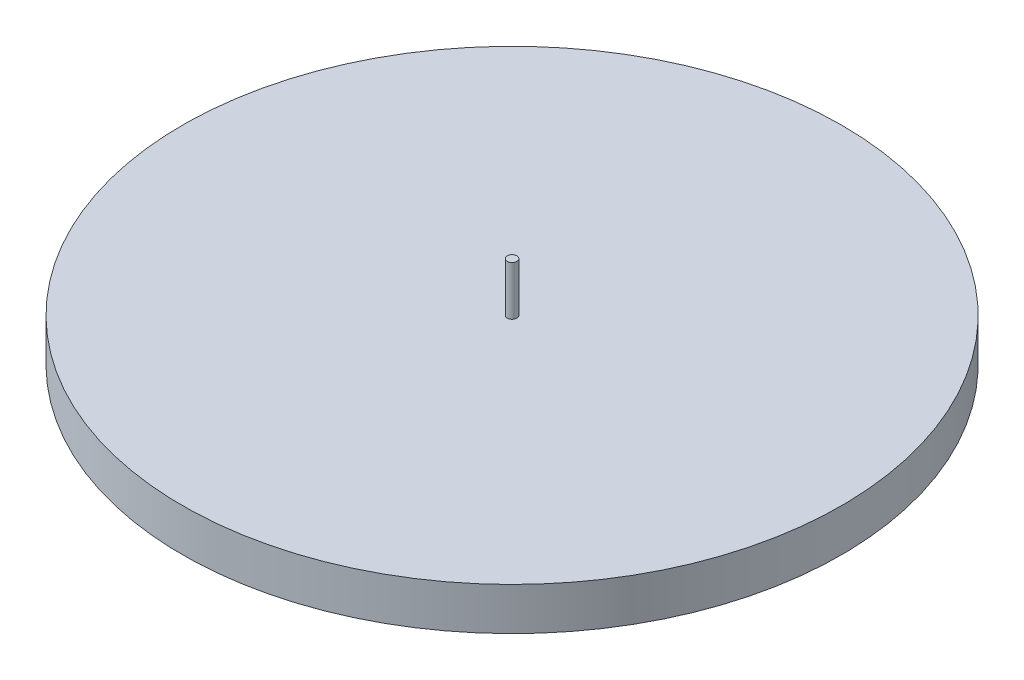
ISO-10303-21;
HEADER;
FILE_DESCRIPTION(('STEP AP214'),'2;1');
FILE_NAME('part.step','',(''),(''),'','','');
FILE_SCHEMA(('AUTOMOTIVE_DESIGN { 1 0 10303 214 1 1 1 1 }'));
ENDSEC;
DATA;
#1=APPLICATION_CONTEXT('core data for automotive mechanical design processes');
#2=APPLICATION_PROTOCOL_DEFINITION('international standard','automotive_design',2000,#1);
#3=PRODUCT_CONTEXT('',#1,'mechanical');
#4=PRODUCT('Part','Part','',(#3));
#5=PRODUCT_RELATED_PRODUCT_CATEGORY('part','',(#4));
#6=PRODUCT_DEFINITION_FORMATION('','',#4);
#7=PRODUCT_DEFINITION_CONTEXT('part definition',#1,'design');
#8=PRODUCT_DEFINITION('design','',#6,#7);
#9=PRODUCT_DEFINITION_SHAPE('','',#8);
#10=(LENGTH_UNIT() NAMED_UNIT(*) SI_UNIT(.MILLI.,.METRE.));
#11=(NAMED_UNIT(*) PLANE_ANGLE_UNIT() SI_UNIT($,.RADIAN.));
#12=(NAMED_UNIT(*) SI_UNIT($,.STERADIAN.) SOLID_ANGLE_UNIT());
#13=UNCERTAINTY_MEASURE_WITH_UNIT(LENGTH_MEASURE(1.E-05),#10,'distance_accuracy_value','');
#14=(GEOMETRIC_REPRESENTATION_CONTEXT(3) GLOBAL_UNCERTAINTY_ASSIGNED_CONTEXT((#13)) GLOBAL_UNIT_ASSIGNED_CONTEXT((#10,
#11,#12)) REPRESENTATION_CONTEXT('',''));
#15=CARTESIAN_POINT('',(0.,0.,0.));
#16=DIRECTION('',(0.,0.,1.));
#17=DIRECTION('',(1.,0.,0.));
#18=AXIS2_PLACEMENT_3D('',#15,#16,#17);
#19=CARTESIAN_POINT('',(951.903947575139,-21.0000000000011,9.96365764277128));
#20=DIRECTION('',(0.,-1.,0.));
#21=DIRECTION('',(0.,0.,-1.));
#22=AXIS2_PLACEMENT_3D('',#19,#20,#21);
#23=PLANE('',#22);
#24=CARTESIAN_POINT('',(951.903947575139,-21.0000000000011,9.96365764277128));
#25=DIRECTION('',(0.,-1.,0.));
#26=DIRECTION('',(0.,0.,-1.));
#27=AXIS2_PLACEMENT_3D('',#24,#25,#26);
#28=CIRCLE('',#27,4.75000000002872);
#29=CARTESIAN_POINT('',(951.903947575139,-21.0000000000009,5.21365764274255));
#30=VERTEX_POINT('',#29);
#31=EDGE_CURVE('E60',#30,#30,#28,.F.);
#32=ORIENTED_EDGE('',*,*,#31,.T.);
#33=EDGE_LOOP('',(#32));
#34=FACE_BOUND('',#33,.T.);
#35=CARTESIAN_POINT('',(951.903947575139,-21.0000000000011,9.96365764277573));
#36=DIRECTION('',(0.,-1.,0.));
#37=DIRECTION('',(0.,0.,-1.));
#38=AXIS2_PLACEMENT_3D('',#35,#36,#37);
#39=CIRCLE('',#38,325.000000000002);
#40=CARTESIAN_POINT('',(951.903947575139,-20.9999999999868,-315.036342357226));
#41=VERTEX_POINT('',#40);
#42=EDGE_CURVE('E52',#41,#41,#39,.F.);
#43=ORIENTED_EDGE('',*,*,#42,.F.);
#44=EDGE_LOOP('',(#43));
#45=FACE_BOUND('',#44,.T.);
#46=ADVANCED_FACE('F46',(#34,#45),#23,.T.);
#47=CARTESIAN_POINT('',(951.903947575139,-1.10328413072125E-12,9.96365764277573));
#48=DIRECTION('',(0.,-1.,0.));
#49=DIRECTION('',(0.,0.,-1.));
#50=AXIS2_PLACEMENT_3D('',#47,#48,#49);
#51=CYLINDRICAL_SURFACE('',#50,325.000000000002);
#52=ORIENTED_EDGE('',*,*,#42,.T.);
#53=EDGE_LOOP('',(#52));
#54=FACE_BOUND('',#53,.T.);
#55=CARTESIAN_POINT('',(951.903947575139,20.9999999999989,9.96365764277573));
#56=DIRECTION('',(0.,-1.,0.));
#57=DIRECTION('',(0.,0.,-1.));
#58=AXIS2_PLACEMENT_3D('',#55,#56,#57);
#59=CIRCLE('',#58,325.000000000002);
#60=CARTESIAN_POINT('',(951.903947575139,21.0000000000132,-315.036342357226));
#61=VERTEX_POINT('',#60);
#62=EDGE_CURVE('E56',#61,#61,#59,.T.);
#63=ORIENTED_EDGE('',*,*,#62,.T.);
#64=EDGE_LOOP('',(#63));
#65=FACE_BOUND('',#64,.T.);
#66=ADVANCED_FACE('F89',(#54,#65),#51,.T.);
#67=CARTESIAN_POINT('',(951.903947575139,20.9999999999989,9.96365764277128));
#68=DIRECTION('',(0.,-1.,0.));
#69=DIRECTION('',(0.,0.,-1.));
#70=AXIS2_PLACEMENT_3D('',#67,#68,#69);
#71=PLANE('',#70);
#72=CARTESIAN_POINT('',(951.903947575139,20.9999999999989,9.96365764277128));
#73=DIRECTION('',(0.,-1.,0.));
#74=DIRECTION('',(0.,0.,-1.));
#75=AXIS2_PLACEMENT_3D('',#72,#73,#74);
#76=CIRCLE('',#75,4.75000000002872);
#77=CARTESIAN_POINT('',(951.903947575139,20.9999999999991,5.21365764274255));
#78=VERTEX_POINT('',#77);
#79=EDGE_CURVE('E11',#78,#78,#76,.F.);
#80=ORIENTED_EDGE('',*,*,#79,.F.);
#81=EDGE_LOOP('',(#80));
#82=FACE_BOUND('',#81,.T.);
#83=ORIENTED_EDGE('',*,*,#62,.F.);
#84=EDGE_LOOP('',(#83));
#85=FACE_BOUND('',#84,.T.);
#86=ADVANCED_FACE('F84',(#82,#85),#71,.F.);
#87=CARTESIAN_POINT('',(951.903947575139,69.5,9.96365764277128));
#88=DIRECTION('',(0.,1.,0.));
#89=DIRECTION('',(0.,0.,1.));
#90=AXIS2_PLACEMENT_3D('',#87,#88,#89);
#91=PLANE('',#90);
#92=CARTESIAN_POINT('',(951.903947575139,69.5,9.96365764277128));
#93=DIRECTION('',(0.,1.,0.));
#94=DIRECTION('',(0.,0.,1.));
#95=AXIS2_PLACEMENT_3D('',#92,#93,#94);
#96=CIRCLE('',#95,4.75000000002872);
#97=CARTESIAN_POINT('',(951.903947575139,69.5,14.7136576428));
#98=VERTEX_POINT('',#97);
#99=EDGE_CURVE('E65',#98,#98,#96,.T.);
#100=ORIENTED_EDGE('',*,*,#99,.T.);
#101=EDGE_LOOP('',(#100));
#102=FACE_BOUND('',#101,.T.);
#103=ADVANCED_FACE('F72',(#102),#91,.T.);
#104=CARTESIAN_POINT('',(951.903947575139,69.5,9.96365764277128));
#105=DIRECTION('',(0.,-1.,0.));
#106=DIRECTION('',(0.,0.,-1.));
#107=AXIS2_PLACEMENT_3D('',#104,#105,#106);
#108=CYLINDRICAL_SURFACE('',#107,4.75000000002872);
#109=ORIENTED_EDGE('',*,*,#99,.F.);
#110=EDGE_LOOP('',(#109));
#111=FACE_BOUND('',#110,.T.);
#112=ORIENTED_EDGE('',*,*,#79,.T.);
#113=EDGE_LOOP('',(#112));
#114=FACE_BOUND('',#113,.T.);
#115=ADVANCED_FACE('F74',(#111,#114),#108,.T.);
#116=ORIENTED_EDGE('',*,*,#31,.F.);
#117=EDGE_LOOP('',(#116));
#118=FACE_BOUND('',#117,.T.);
#119=CARTESIAN_POINT('',(951.903947575139,-69.5,9.96365764277128));
#120=DIRECTION('',(0.,1.,0.));
#121=DIRECTION('',(0.,0.,1.));
#122=AXIS2_PLACEMENT_3D('',#119,#120,#121);
#123=CIRCLE('',#122,4.75000000002872);
#124=CARTESIAN_POINT('',(951.903947575139,-69.5,14.7136576428));
#125=VERTEX_POINT('',#124);
#126=EDGE_CURVE('E66',#125,#125,#123,.T.);
#127=ORIENTED_EDGE('',*,*,#126,.T.);
#128=EDGE_LOOP('',(#127));
#129=FACE_BOUND('',#128,.T.);
#130=ADVANCED_FACE('F76',(#118,#129),#108,.T.);
#131=CARTESIAN_POINT('',(951.903947575139,-69.5,9.96365764277128));
#132=DIRECTION('',(0.,1.,0.));
#133=DIRECTION('',(0.,0.,1.));
#134=AXIS2_PLACEMENT_3D('',#131,#132,#133);
#135=PLANE('',#134);
#136=ORIENTED_EDGE('',*,*,#126,.F.);
#137=EDGE_LOOP('',(#136));
#138=FACE_BOUND('',#137,.T.);
#139=ADVANCED_FACE('F82',(#138),#135,.F.);
#140=CLOSED_SHELL('',(#46,#66,#86,#103,#115,#130,#139));
#141=MANIFOLD_SOLID_BREP('B2',#140);
#142=ADVANCED_BREP_SHAPE_REPRESENTATION('',(#18,#141),#14);
#143=SHAPE_DEFINITION_REPRESENTATION(#9,#142);
ENDSEC;
END-ISO-10303-21;
